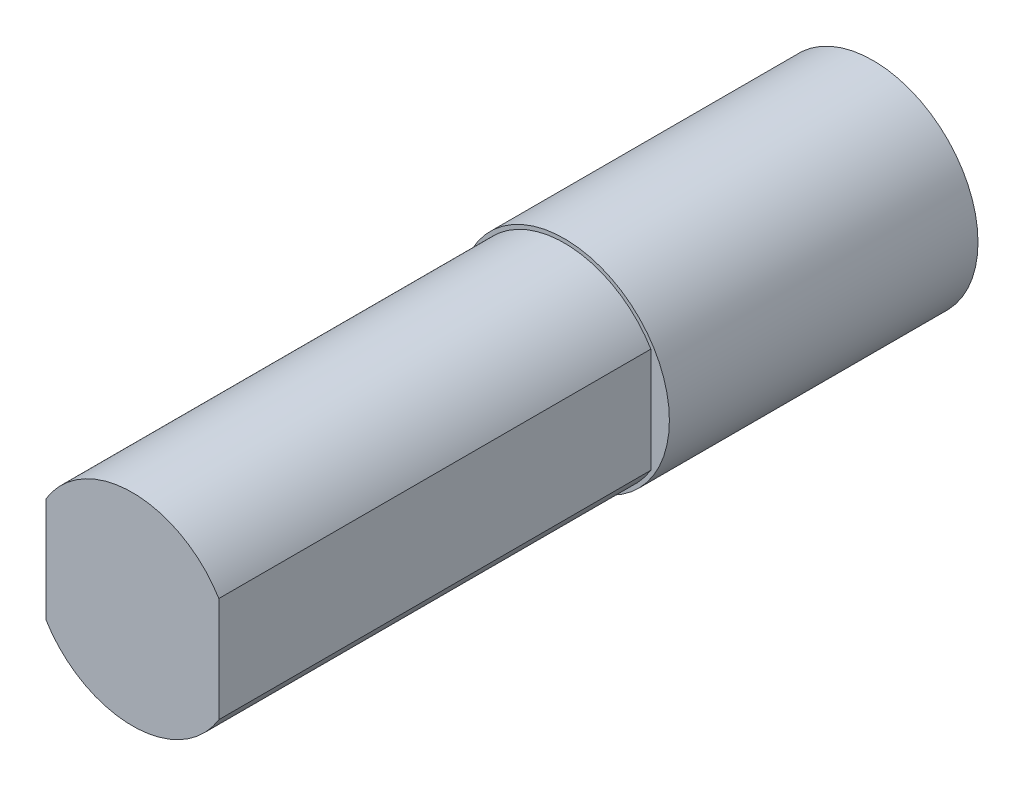
ISO-10303-21;
HEADER;
FILE_DESCRIPTION(('STEP AP214'),'2;1');
FILE_NAME('part.step','',(''),(''),'','','');
FILE_SCHEMA(('AUTOMOTIVE_DESIGN { 1 0 10303 214 1 1 1 1 }'));
ENDSEC;
DATA;
#1=APPLICATION_CONTEXT('core data for automotive mechanical design processes');
#2=APPLICATION_PROTOCOL_DEFINITION('international standard','automotive_design',2000,#1);
#3=PRODUCT_CONTEXT('',#1,'mechanical');
#4=PRODUCT('Part','Part','',(#3));
#5=PRODUCT_RELATED_PRODUCT_CATEGORY('part','',(#4));
#6=PRODUCT_DEFINITION_FORMATION('','',#4);
#7=PRODUCT_DEFINITION_CONTEXT('part definition',#1,'design');
#8=PRODUCT_DEFINITION('design','',#6,#7);
#9=PRODUCT_DEFINITION_SHAPE('','',#8);
#10=(LENGTH_UNIT() NAMED_UNIT(*) SI_UNIT(.MILLI.,.METRE.));
#11=(NAMED_UNIT(*) PLANE_ANGLE_UNIT() SI_UNIT($,.RADIAN.));
#12=(NAMED_UNIT(*) SI_UNIT($,.STERADIAN.) SOLID_ANGLE_UNIT());
#13=UNCERTAINTY_MEASURE_WITH_UNIT(LENGTH_MEASURE(1.E-05),#10,'distance_accuracy_value','');
#14=(GEOMETRIC_REPRESENTATION_CONTEXT(3) GLOBAL_UNCERTAINTY_ASSIGNED_CONTEXT((#13)) GLOBAL_UNIT_ASSIGNED_CONTEXT((#10,
#11,#12)) REPRESENTATION_CONTEXT('',''));
#15=CARTESIAN_POINT('',(0.,0.,0.));
#16=DIRECTION('',(0.,0.,1.));
#17=DIRECTION('',(1.,0.,0.));
#18=AXIS2_PLACEMENT_3D('',#15,#16,#17);
#19=CARTESIAN_POINT('',(0.,0.,0.));
#20=DIRECTION('',(0.,0.,1.));
#21=DIRECTION('',(1.,0.,0.));
#22=AXIS2_PLACEMENT_3D('',#19,#20,#21);
#23=PLANE('',#22);
#24=CARTESIAN_POINT('',(0.,0.,0.));
#25=DIRECTION('',(0.,0.,1.));
#26=DIRECTION('',(1.,0.,0.));
#27=AXIS2_PLACEMENT_3D('',#24,#25,#26);
#28=CIRCLE('',#27,3.4);
#29=CARTESIAN_POINT('',(3.4,0.,0.));
#30=VERTEX_POINT('',#29);
#31=EDGE_CURVE('E11',#30,#30,#28,.T.);
#32=ORIENTED_EDGE('',*,*,#31,.F.);
#33=EDGE_LOOP('',(#32));
#34=FACE_BOUND('',#33,.T.);
#35=CARTESIAN_POINT('',(0.,0.,0.));
#36=DIRECTION('',(0.,0.,1.));
#37=DIRECTION('',(-1.,0.,0.));
#38=AXIS2_PLACEMENT_3D('',#35,#36,#37);
#39=CIRCLE('',#38,2.15);
#40=CARTESIAN_POINT('',(-1.7,-1.31624465810882,0.));
#41=VERTEX_POINT('',#40);
#42=CARTESIAN_POINT('',(-1.7,1.31624465810882,0.));
#43=VERTEX_POINT('',#42);
#44=EDGE_CURVE('E121',#41,#43,#39,.T.);
#45=ORIENTED_EDGE('',*,*,#44,.T.);
#46=DIRECTION('',(0.,-1.,0.));
#47=VECTOR('',#46,1.);
#48=CARTESIAN_POINT('',(-1.7,-1.31624465810882,0.));
#49=LINE('',#48,#47);
#50=EDGE_CURVE('E132',#43,#41,#49,.T.);
#51=ORIENTED_EDGE('',*,*,#50,.T.);
#52=EDGE_LOOP('',(#45,#51));
#53=FACE_BOUND('',#52,.T.);
#54=ADVANCED_FACE('F39',(#34,#53),#23,.F.);
#55=CARTESIAN_POINT('',(0.,0.,8.));
#56=DIRECTION('',(0.,0.,-1.));
#57=DIRECTION('',(-1.,0.,0.));
#58=AXIS2_PLACEMENT_3D('',#55,#56,#57);
#59=CYLINDRICAL_SURFACE('',#58,3.4);
#60=ORIENTED_EDGE('',*,*,#31,.T.);
#61=EDGE_LOOP('',(#60));
#62=FACE_BOUND('',#61,.T.);
#63=CARTESIAN_POINT('',(0.,0.,10.));
#64=DIRECTION('',(0.,0.,1.));
#65=DIRECTION('',(1.,0.,0.));
#66=AXIS2_PLACEMENT_3D('',#63,#64,#65);
#67=CIRCLE('',#66,3.4);
#68=CARTESIAN_POINT('',(3.4,0.,10.));
#69=VERTEX_POINT('',#68);
#70=EDGE_CURVE('E116',#69,#69,#67,.T.);
#71=ORIENTED_EDGE('',*,*,#70,.F.);
#72=EDGE_LOOP('',(#71));
#73=FACE_BOUND('',#72,.T.);
#74=ADVANCED_FACE('F41',(#62,#73),#59,.T.);
#75=CARTESIAN_POINT('',(0.,0.,8.));
#76=DIRECTION('',(0.,0.,-1.));
#77=DIRECTION('',(-1.,0.,0.));
#78=AXIS2_PLACEMENT_3D('',#75,#76,#77);
#79=CYLINDRICAL_SURFACE('',#78,2.15);
#80=ORIENTED_EDGE('',*,*,#44,.F.);
#81=DIRECTION('',(0.,0.,-1.));
#82=VECTOR('',#81,1.);
#83=CARTESIAN_POINT('',(-1.7,-1.31624465810882,8.));
#84=LINE('',#83,#82);
#85=CARTESIAN_POINT('',(-1.7,-1.31624465810882,8.));
#86=VERTEX_POINT('',#85);
#87=EDGE_CURVE('E136',#86,#41,#84,.T.);
#88=ORIENTED_EDGE('',*,*,#87,.F.);
#89=CARTESIAN_POINT('',(0.,0.,8.));
#90=DIRECTION('',(0.,0.,1.));
#91=DIRECTION('',(-1.,0.,0.));
#92=AXIS2_PLACEMENT_3D('',#89,#90,#91);
#93=CIRCLE('',#92,2.15);
#94=CARTESIAN_POINT('',(-1.7,1.31624465810882,8.));
#95=VERTEX_POINT('',#94);
#96=EDGE_CURVE('E127',#86,#95,#93,.T.);
#97=ORIENTED_EDGE('',*,*,#96,.T.);
#98=DIRECTION('',(0.,0.,-1.));
#99=VECTOR('',#98,1.);
#100=CARTESIAN_POINT('',(-1.7,1.31624465810882,8.));
#101=LINE('',#100,#99);
#102=EDGE_CURVE('E48',#95,#43,#101,.T.);
#103=ORIENTED_EDGE('',*,*,#102,.T.);
#104=EDGE_LOOP('',(#80,#88,#97,#103));
#105=FACE_BOUND('',#104,.T.);
#106=ADVANCED_FACE('F149',(#105),#79,.F.);
#107=CARTESIAN_POINT('',(-1.7,-1.31624465810882,8.));
#108=DIRECTION('',(1.,0.,0.));
#109=DIRECTION('',(0.,0.,-1.));
#110=AXIS2_PLACEMENT_3D('',#107,#108,#109);
#111=PLANE('',#110);
#112=ORIENTED_EDGE('',*,*,#50,.F.);
#113=ORIENTED_EDGE('',*,*,#102,.F.);
#114=DIRECTION('',(0.,-1.,0.));
#115=VECTOR('',#114,1.);
#116=CARTESIAN_POINT('',(-1.7,-1.31624465810882,8.));
#117=LINE('',#116,#115);
#118=EDGE_CURVE('E131',#95,#86,#117,.T.);
#119=ORIENTED_EDGE('',*,*,#118,.T.);
#120=ORIENTED_EDGE('',*,*,#87,.T.);
#121=EDGE_LOOP('',(#112,#113,#119,#120));
#122=FACE_BOUND('',#121,.T.);
#123=ADVANCED_FACE('F153',(#122),#111,.T.);
#124=CARTESIAN_POINT('',(0.,0.,8.));
#125=DIRECTION('',(0.,0.,1.));
#126=DIRECTION('',(1.,0.,0.));
#127=AXIS2_PLACEMENT_3D('',#124,#125,#126);
#128=PLANE('',#127);
#129=ORIENTED_EDGE('',*,*,#118,.F.);
#130=ORIENTED_EDGE('',*,*,#96,.F.);
#131=EDGE_LOOP('',(#129,#130));
#132=FACE_BOUND('',#131,.T.);
#133=ADVANCED_FACE('F155',(#132),#128,.F.);
#134=CARTESIAN_POINT('',(0.,0.,10.));
#135=DIRECTION('',(0.,0.,1.));
#136=DIRECTION('',(1.,0.,0.));
#137=AXIS2_PLACEMENT_3D('',#134,#135,#136);
#138=PLANE('',#137);
#139=CARTESIAN_POINT('',(0.,8.3398529677377E-13,10.));
#140=DIRECTION('',(0.,0.,1.));
#141=DIRECTION('',(1.,0.,0.));
#142=AXIS2_PLACEMENT_3D('',#139,#140,#141);
#143=CIRCLE('',#142,3.27566787083227);
#144=CARTESIAN_POINT('',(-2.8,-1.7,10.));
#145=VERTEX_POINT('',#144);
#146=CARTESIAN_POINT('',(2.8,-1.7,10.));
#147=VERTEX_POINT('',#146);
#148=EDGE_CURVE('E55',#145,#147,#143,.T.);
#149=ORIENTED_EDGE('',*,*,#148,.F.);
#150=DIRECTION('',(0.,-1.,0.));
#151=VECTOR('',#150,1.);
#152=CARTESIAN_POINT('',(-2.8,-1.7,10.));
#153=LINE('',#152,#151);
#154=CARTESIAN_POINT('',(-2.8,1.7,10.));
#155=VERTEX_POINT('',#154);
#156=EDGE_CURVE('E59',#155,#145,#153,.T.);
#157=ORIENTED_EDGE('',*,*,#156,.F.);
#158=CARTESIAN_POINT('',(0.,8.3398529677377E-13,10.));
#159=DIRECTION('',(0.,0.,1.));
#160=DIRECTION('',(-1.,0.,0.));
#161=AXIS2_PLACEMENT_3D('',#158,#159,#160);
#162=CIRCLE('',#161,3.27566787083141);
#163=CARTESIAN_POINT('',(2.8,1.7,10.));
#164=VERTEX_POINT('',#163);
#165=EDGE_CURVE('E245',#164,#155,#162,.T.);
#166=ORIENTED_EDGE('',*,*,#165,.F.);
#167=DIRECTION('',(0.,1.,0.));
#168=VECTOR('',#167,1.);
#169=CARTESIAN_POINT('',(2.8,-1.7,10.));
#170=LINE('',#169,#168);
#171=EDGE_CURVE('E255',#147,#164,#170,.T.);
#172=ORIENTED_EDGE('',*,*,#171,.F.);
#173=EDGE_LOOP('',(#149,#157,#166,#172));
#174=FACE_BOUND('',#173,.T.);
#175=ORIENTED_EDGE('',*,*,#70,.T.);
#176=EDGE_LOOP('',(#175));
#177=FACE_BOUND('',#176,.T.);
#178=ADVANCED_FACE('F157',(#174,#177),#138,.T.);
#179=CARTESIAN_POINT('',(0.,8.3398529677377E-13,24.));
#180=DIRECTION('',(0.,0.,-1.));
#181=DIRECTION('',(-1.,0.,0.));
#182=AXIS2_PLACEMENT_3D('',#179,#180,#181);
#183=CYLINDRICAL_SURFACE('',#182,3.27566787083227);
#184=ORIENTED_EDGE('',*,*,#148,.T.);
#185=DIRECTION('',(0.,0.,-1.));
#186=VECTOR('',#185,1.);
#187=CARTESIAN_POINT('',(2.8,-1.7,24.));
#188=LINE('',#187,#186);
#189=CARTESIAN_POINT('',(2.8,-1.7,24.));
#190=VERTEX_POINT('',#189);
#191=EDGE_CURVE('E96',#190,#147,#188,.T.);
#192=ORIENTED_EDGE('',*,*,#191,.F.);
#193=CARTESIAN_POINT('',(0.,8.3398529677377E-13,24.));
#194=DIRECTION('',(0.,0.,1.));
#195=DIRECTION('',(1.,0.,0.));
#196=AXIS2_PLACEMENT_3D('',#193,#194,#195);
#197=CIRCLE('',#196,3.27566787083227);
#198=CARTESIAN_POINT('',(-2.8,-1.7,24.));
#199=VERTEX_POINT('',#198);
#200=EDGE_CURVE('E103',#199,#190,#197,.T.);
#201=ORIENTED_EDGE('',*,*,#200,.F.);
#202=DIRECTION('',(0.,0.,-1.));
#203=VECTOR('',#202,1.);
#204=CARTESIAN_POINT('',(-2.8,-1.7,24.));
#205=LINE('',#204,#203);
#206=EDGE_CURVE('E242',#199,#145,#205,.T.);
#207=ORIENTED_EDGE('',*,*,#206,.T.);
#208=EDGE_LOOP('',(#184,#192,#201,#207));
#209=FACE_BOUND('',#208,.T.);
#210=ADVANCED_FACE('F114',(#209),#183,.T.);
#211=CARTESIAN_POINT('',(2.8,-1.7,24.));
#212=DIRECTION('',(-1.,0.,0.));
#213=DIRECTION('',(0.,0.,1.));
#214=AXIS2_PLACEMENT_3D('',#211,#212,#213);
#215=PLANE('',#214);
#216=ORIENTED_EDGE('',*,*,#171,.T.);
#217=DIRECTION('',(0.,0.,-1.));
#218=VECTOR('',#217,1.);
#219=CARTESIAN_POINT('',(2.8,1.7,24.));
#220=LINE('',#219,#218);
#221=CARTESIAN_POINT('',(2.8,1.7,24.));
#222=VERTEX_POINT('',#221);
#223=EDGE_CURVE('E98',#222,#164,#220,.T.);
#224=ORIENTED_EDGE('',*,*,#223,.F.);
#225=DIRECTION('',(0.,1.,0.));
#226=VECTOR('',#225,1.);
#227=CARTESIAN_POINT('',(2.8,-1.7,24.));
#228=LINE('',#227,#226);
#229=EDGE_CURVE('E91',#190,#222,#228,.T.);
#230=ORIENTED_EDGE('',*,*,#229,.F.);
#231=ORIENTED_EDGE('',*,*,#191,.T.);
#232=EDGE_LOOP('',(#216,#224,#230,#231));
#233=FACE_BOUND('',#232,.T.);
#234=ADVANCED_FACE('F94',(#233),#215,.F.);
#235=CARTESIAN_POINT('',(0.,8.3398529677377E-13,24.));
#236=DIRECTION('',(0.,0.,-1.));
#237=DIRECTION('',(-1.,0.,0.));
#238=AXIS2_PLACEMENT_3D('',#235,#236,#237);
#239=CYLINDRICAL_SURFACE('',#238,3.27566787083141);
#240=ORIENTED_EDGE('',*,*,#165,.T.);
#241=DIRECTION('',(0.,0.,-1.));
#242=VECTOR('',#241,1.);
#243=CARTESIAN_POINT('',(-2.8,1.7,24.));
#244=LINE('',#243,#242);
#245=CARTESIAN_POINT('',(-2.8,1.7,24.));
#246=VERTEX_POINT('',#245);
#247=EDGE_CURVE('E123',#246,#155,#244,.T.);
#248=ORIENTED_EDGE('',*,*,#247,.F.);
#249=CARTESIAN_POINT('',(0.,8.3398529677377E-13,24.));
#250=DIRECTION('',(0.,0.,1.));
#251=DIRECTION('',(-1.,0.,0.));
#252=AXIS2_PLACEMENT_3D('',#249,#250,#251);
#253=CIRCLE('',#252,3.27566787083141);
#254=EDGE_CURVE('E102',#222,#246,#253,.T.);
#255=ORIENTED_EDGE('',*,*,#254,.F.);
#256=ORIENTED_EDGE('',*,*,#223,.T.);
#257=EDGE_LOOP('',(#240,#248,#255,#256));
#258=FACE_BOUND('',#257,.T.);
#259=ADVANCED_FACE('F210',(#258),#239,.T.);
#260=CARTESIAN_POINT('',(-2.8,-1.7,24.));
#261=DIRECTION('',(1.,0.,0.));
#262=DIRECTION('',(0.,0.,-1.));
#263=AXIS2_PLACEMENT_3D('',#260,#261,#262);
#264=PLANE('',#263);
#265=ORIENTED_EDGE('',*,*,#156,.T.);
#266=ORIENTED_EDGE('',*,*,#206,.F.);
#267=DIRECTION('',(0.,-1.,0.));
#268=VECTOR('',#267,1.);
#269=CARTESIAN_POINT('',(-2.8,-1.7,24.));
#270=LINE('',#269,#268);
#271=EDGE_CURVE('E108',#246,#199,#270,.T.);
#272=ORIENTED_EDGE('',*,*,#271,.F.);
#273=ORIENTED_EDGE('',*,*,#247,.T.);
#274=EDGE_LOOP('',(#265,#266,#272,#273));
#275=FACE_BOUND('',#274,.T.);
#276=ADVANCED_FACE('F219',(#275),#264,.F.);
#277=CARTESIAN_POINT('',(0.,8.3398529677377E-13,24.));
#278=DIRECTION('',(0.,0.,1.));
#279=DIRECTION('',(1.,0.,0.));
#280=AXIS2_PLACEMENT_3D('',#277,#278,#279);
#281=PLANE('',#280);
#282=ORIENTED_EDGE('',*,*,#200,.T.);
#283=ORIENTED_EDGE('',*,*,#229,.T.);
#284=ORIENTED_EDGE('',*,*,#254,.T.);
#285=ORIENTED_EDGE('',*,*,#271,.T.);
#286=EDGE_LOOP('',(#282,#283,#284,#285));
#287=FACE_BOUND('',#286,.T.);
#288=ADVANCED_FACE('F106',(#287),#281,.T.);
#289=CLOSED_SHELL('',(#54,#74,#106,#123,#133,#178,#210,#234,#259,#276,#288));
#290=MANIFOLD_SOLID_BREP('B2',#289);
#291=ADVANCED_BREP_SHAPE_REPRESENTATION('',(#18,#290),#14);
#292=SHAPE_DEFINITION_REPRESENTATION(#9,#291);
ENDSEC;
END-ISO-10303-21;
